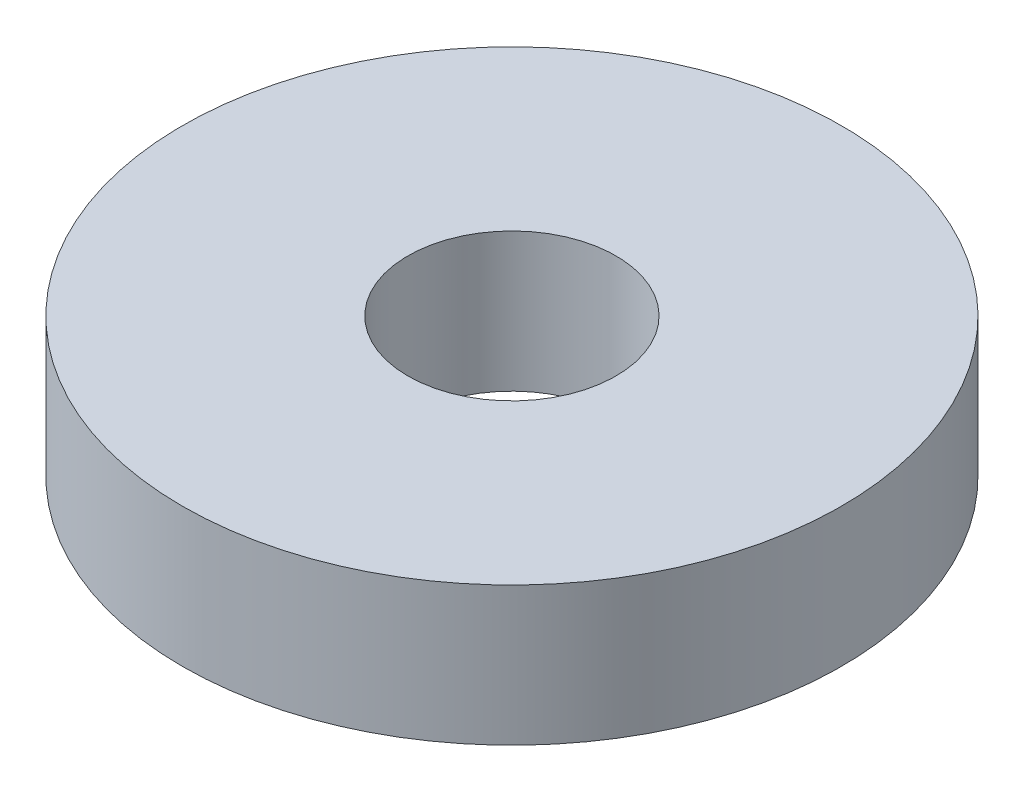
ISO-10303-21;
HEADER;
FILE_DESCRIPTION(('STEP AP214'),'2;1');
FILE_NAME('part.step','',(''),(''),'','','');
FILE_SCHEMA(('AUTOMOTIVE_DESIGN { 1 0 10303 214 1 1 1 1 }'));
ENDSEC;
DATA;
#1=APPLICATION_CONTEXT('core data for automotive mechanical design processes');
#2=APPLICATION_PROTOCOL_DEFINITION('international standard','automotive_design',2000,#1);
#3=PRODUCT_CONTEXT('',#1,'mechanical');
#4=PRODUCT('Part','Part','',(#3));
#5=PRODUCT_RELATED_PRODUCT_CATEGORY('part','',(#4));
#6=PRODUCT_DEFINITION_FORMATION('','',#4);
#7=PRODUCT_DEFINITION_CONTEXT('part definition',#1,'design');
#8=PRODUCT_DEFINITION('design','',#6,#7);
#9=PRODUCT_DEFINITION_SHAPE('','',#8);
#10=(LENGTH_UNIT() NAMED_UNIT(*) SI_UNIT(.MILLI.,.METRE.));
#11=(NAMED_UNIT(*) PLANE_ANGLE_UNIT() SI_UNIT($,.RADIAN.));
#12=(NAMED_UNIT(*) SI_UNIT($,.STERADIAN.) SOLID_ANGLE_UNIT());
#13=UNCERTAINTY_MEASURE_WITH_UNIT(LENGTH_MEASURE(1.E-05),#10,'distance_accuracy_value','');
#14=(GEOMETRIC_REPRESENTATION_CONTEXT(3) GLOBAL_UNCERTAINTY_ASSIGNED_CONTEXT((#13)) GLOBAL_UNIT_ASSIGNED_CONTEXT((#10,
#11,#12)) REPRESENTATION_CONTEXT('',''));
#15=CARTESIAN_POINT('',(0.,0.,0.));
#16=DIRECTION('',(0.,0.,1.));
#17=DIRECTION('',(1.,0.,0.));
#18=AXIS2_PLACEMENT_3D('',#15,#16,#17);
#19=CARTESIAN_POINT('',(0.,4.,0.));
#20=DIRECTION('',(0.,1.,0.));
#21=DIRECTION('',(0.,0.,1.));
#22=AXIS2_PLACEMENT_3D('',#19,#20,#21);
#23=PLANE('',#22);
#24=CARTESIAN_POINT('',(0.,4.,0.));
#25=DIRECTION('',(0.,1.,0.));
#26=DIRECTION('',(0.,0.,1.));
#27=AXIS2_PLACEMENT_3D('',#24,#25,#26);
#28=CIRCLE('',#27,9.5);
#29=CARTESIAN_POINT('',(0.,4.,9.5));
#30=VERTEX_POINT('',#29);
#31=EDGE_CURVE('E10',#30,#30,#28,.T.);
#32=ORIENTED_EDGE('',*,*,#31,.T.);
#33=EDGE_LOOP('',(#32));
#34=FACE_BOUND('',#33,.T.);
#35=CARTESIAN_POINT('',(0.,4.,0.));
#36=DIRECTION('',(0.,1.,0.));
#37=DIRECTION('',(0.,0.,1.));
#38=AXIS2_PLACEMENT_3D('',#35,#36,#37);
#39=CIRCLE('',#38,3.);
#40=CARTESIAN_POINT('',(0.,4.,3.));
#41=VERTEX_POINT('',#40);
#42=EDGE_CURVE('E51',#41,#41,#39,.T.);
#43=ORIENTED_EDGE('',*,*,#42,.F.);
#44=EDGE_LOOP('',(#43));
#45=FACE_BOUND('',#44,.T.);
#46=ADVANCED_FACE('F40',(#34,#45),#23,.T.);
#47=CARTESIAN_POINT('',(0.,0.,0.));
#48=DIRECTION('',(0.,1.,0.));
#49=DIRECTION('',(0.,0.,1.));
#50=AXIS2_PLACEMENT_3D('',#47,#48,#49);
#51=PLANE('',#50);
#52=CARTESIAN_POINT('',(0.,0.,0.));
#53=DIRECTION('',(0.,1.,0.));
#54=DIRECTION('',(0.,0.,1.));
#55=AXIS2_PLACEMENT_3D('',#52,#53,#54);
#56=CIRCLE('',#55,9.5);
#57=CARTESIAN_POINT('',(0.,0.,9.5));
#58=VERTEX_POINT('',#57);
#59=EDGE_CURVE('E44',#58,#58,#56,.T.);
#60=ORIENTED_EDGE('',*,*,#59,.F.);
#61=EDGE_LOOP('',(#60));
#62=FACE_BOUND('',#61,.T.);
#63=CARTESIAN_POINT('',(0.,0.,0.));
#64=DIRECTION('',(0.,1.,0.));
#65=DIRECTION('',(0.,0.,1.));
#66=AXIS2_PLACEMENT_3D('',#63,#64,#65);
#67=CIRCLE('',#66,3.);
#68=CARTESIAN_POINT('',(0.,0.,3.));
#69=VERTEX_POINT('',#68);
#70=EDGE_CURVE('E53',#69,#69,#67,.T.);
#71=ORIENTED_EDGE('',*,*,#70,.T.);
#72=EDGE_LOOP('',(#71));
#73=FACE_BOUND('',#72,.T.);
#74=ADVANCED_FACE('F63',(#62,#73),#51,.F.);
#75=CARTESIAN_POINT('',(0.,4.,0.));
#76=DIRECTION('',(0.,-1.,0.));
#77=DIRECTION('',(0.,0.,-1.));
#78=AXIS2_PLACEMENT_3D('',#75,#76,#77);
#79=CYLINDRICAL_SURFACE('',#78,9.5);
#80=ORIENTED_EDGE('',*,*,#31,.F.);
#81=EDGE_LOOP('',(#80));
#82=FACE_BOUND('',#81,.T.);
#83=ORIENTED_EDGE('',*,*,#59,.T.);
#84=EDGE_LOOP('',(#83));
#85=FACE_BOUND('',#84,.T.);
#86=ADVANCED_FACE('F42',(#82,#85),#79,.T.);
#87=CARTESIAN_POINT('',(0.,4.,0.));
#88=DIRECTION('',(0.,-1.,0.));
#89=DIRECTION('',(0.,0.,-1.));
#90=AXIS2_PLACEMENT_3D('',#87,#88,#89);
#91=CYLINDRICAL_SURFACE('',#90,3.);
#92=ORIENTED_EDGE('',*,*,#42,.T.);
#93=EDGE_LOOP('',(#92));
#94=FACE_BOUND('',#93,.T.);
#95=ORIENTED_EDGE('',*,*,#70,.F.);
#96=EDGE_LOOP('',(#95));
#97=FACE_BOUND('',#96,.T.);
#98=ADVANCED_FACE('F59',(#94,#97),#91,.F.);
#99=CLOSED_SHELL('',(#46,#74,#86,#98));
#100=MANIFOLD_SOLID_BREP('B2',#99);
#101=ADVANCED_BREP_SHAPE_REPRESENTATION('',(#18,#100),#14);
#102=SHAPE_DEFINITION_REPRESENTATION(#9,#101);
ENDSEC;
END-ISO-10303-21;
